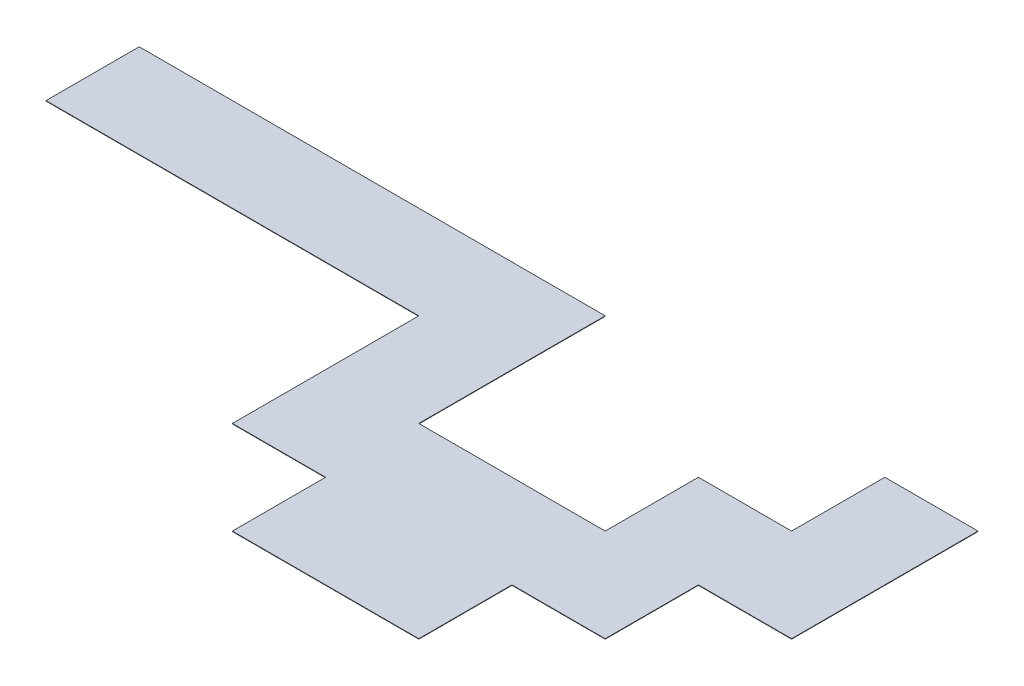
ISO-10303-21;
HEADER;
FILE_DESCRIPTION(('STEP AP214'),'2;1');
FILE_NAME('part.step','',(''),(''),'','','');
FILE_SCHEMA(('AUTOMOTIVE_DESIGN { 1 0 10303 214 1 1 1 1 }'));
ENDSEC;
DATA;
#1=APPLICATION_CONTEXT('core data for automotive mechanical design processes');
#2=APPLICATION_PROTOCOL_DEFINITION('international standard','automotive_design',2000,#1);
#3=PRODUCT_CONTEXT('',#1,'mechanical');
#4=PRODUCT('Part','Part','',(#3));
#5=PRODUCT_RELATED_PRODUCT_CATEGORY('part','',(#4));
#6=PRODUCT_DEFINITION_FORMATION('','',#4);
#7=PRODUCT_DEFINITION_CONTEXT('part definition',#1,'design');
#8=PRODUCT_DEFINITION('design','',#6,#7);
#9=PRODUCT_DEFINITION_SHAPE('','',#8);
#10=(LENGTH_UNIT() NAMED_UNIT(*) SI_UNIT(.MILLI.,.METRE.));
#11=(NAMED_UNIT(*) PLANE_ANGLE_UNIT() SI_UNIT($,.RADIAN.));
#12=(NAMED_UNIT(*) SI_UNIT($,.STERADIAN.) SOLID_ANGLE_UNIT());
#13=UNCERTAINTY_MEASURE_WITH_UNIT(LENGTH_MEASURE(1.E-05),#10,'distance_accuracy_value','');
#14=(GEOMETRIC_REPRESENTATION_CONTEXT(3) GLOBAL_UNCERTAINTY_ASSIGNED_CONTEXT((#13)) GLOBAL_UNIT_ASSIGNED_CONTEXT((#10,
#11,#12)) REPRESENTATION_CONTEXT('',''));
#15=CARTESIAN_POINT('',(0.,0.,0.));
#16=DIRECTION('',(0.,0.,1.));
#17=DIRECTION('',(1.,0.,0.));
#18=AXIS2_PLACEMENT_3D('',#15,#16,#17);
#19=CARTESIAN_POINT('',(4.57318429210723,2.601,2.7766235530204E-13));
#20=DIRECTION('',(1.,0.,0.));
#21=DIRECTION('',(0.,0.,-1.));
#22=AXIS2_PLACEMENT_3D('',#19,#20,#21);
#23=PLANE('',#22);
#24=DIRECTION('',(0.,0.,1.));
#25=VECTOR('',#24,1.);
#26=CARTESIAN_POINT('',(4.57318429210723,2.6,2.7766235530204E-13));
#27=LINE('',#26,#25);
#28=CARTESIAN_POINT('',(4.57318429210704,2.6,2.91907068929162));
#29=VERTEX_POINT('',#28);
#30=CARTESIAN_POINT('',(4.57318429210704,2.6,3.11907068929162));
#31=VERTEX_POINT('',#30);
#32=EDGE_CURVE('E11',#29,#31,#27,.T.);
#33=ORIENTED_EDGE('',*,*,#32,.F.);
#34=DIRECTION('',(0.,-1.,0.));
#35=VECTOR('',#34,1.);
#36=CARTESIAN_POINT('',(4.57318429210704,2.601,2.91907068929162));
#37=LINE('',#36,#35);
#38=CARTESIAN_POINT('',(4.57318429210704,2.601,2.91907068929162));
#39=VERTEX_POINT('',#38);
#40=EDGE_CURVE('E24',#39,#29,#37,.T.);
#41=ORIENTED_EDGE('',*,*,#40,.F.);
#42=DIRECTION('',(0.,0.,1.));
#43=VECTOR('',#42,1.);
#44=CARTESIAN_POINT('',(4.57318429210723,2.601,2.7766235530204E-13));
#45=LINE('',#44,#43);
#46=CARTESIAN_POINT('',(4.57318429210704,2.601,3.11907068929162));
#47=VERTEX_POINT('',#46);
#48=EDGE_CURVE('E291',#39,#47,#45,.T.);
#49=ORIENTED_EDGE('',*,*,#48,.T.);
#50=DIRECTION('',(0.,-1.,0.));
#51=VECTOR('',#50,1.);
#52=CARTESIAN_POINT('',(4.57318429210704,2.601,3.11907068929162));
#53=LINE('',#52,#51);
#54=EDGE_CURVE('E162',#47,#31,#53,.T.);
#55=ORIENTED_EDGE('',*,*,#54,.T.);
#56=EDGE_LOOP('',(#33,#41,#49,#55));
#57=FACE_BOUND('',#56,.T.);
#58=ADVANCED_FACE('F17',(#57),#23,.T.);
#59=CARTESIAN_POINT('',(0.,2.601,2.91907068929162));
#60=DIRECTION('',(0.,0.,-1.));
#61=DIRECTION('',(-1.,0.,0.));
#62=AXIS2_PLACEMENT_3D('',#59,#60,#61);
#63=PLANE('',#62);
#64=DIRECTION('',(1.,0.,0.));
#65=VECTOR('',#64,1.);
#66=CARTESIAN_POINT('',(0.,2.6,2.91907068929162));
#67=LINE('',#66,#65);
#68=CARTESIAN_POINT('',(4.7731842921067,2.6,2.91907068929162));
#69=VERTEX_POINT('',#68);
#70=EDGE_CURVE('E288',#29,#69,#67,.T.);
#71=ORIENTED_EDGE('',*,*,#70,.T.);
#72=DIRECTION('',(0.,-1.,0.));
#73=VECTOR('',#72,1.);
#74=CARTESIAN_POINT('',(4.7731842921067,2.601,2.91907068929162));
#75=LINE('',#74,#73);
#76=CARTESIAN_POINT('',(4.7731842921067,2.601,2.91907068929162));
#77=VERTEX_POINT('',#76);
#78=EDGE_CURVE('E285',#77,#69,#75,.T.);
#79=ORIENTED_EDGE('',*,*,#78,.F.);
#80=DIRECTION('',(1.,0.,0.));
#81=VECTOR('',#80,1.);
#82=CARTESIAN_POINT('',(0.,2.601,2.91907068929162));
#83=LINE('',#82,#81);
#84=EDGE_CURVE('E282',#39,#77,#83,.T.);
#85=ORIENTED_EDGE('',*,*,#84,.F.);
#86=ORIENTED_EDGE('',*,*,#40,.T.);
#87=EDGE_LOOP('',(#71,#79,#85,#86));
#88=FACE_BOUND('',#87,.T.);
#89=ADVANCED_FACE('F294',(#88),#63,.F.);
#90=CARTESIAN_POINT('',(4.77318429210686,2.601,2.69105032517151E-13));
#91=DIRECTION('',(1.,0.,0.));
#92=DIRECTION('',(0.,0.,-1.));
#93=AXIS2_PLACEMENT_3D('',#90,#91,#92);
#94=PLANE('',#93);
#95=DIRECTION('',(0.,0.,1.));
#96=VECTOR('',#95,1.);
#97=CARTESIAN_POINT('',(4.77318429210686,2.6,2.69105032517151E-13));
#98=LINE('',#97,#96);
#99=CARTESIAN_POINT('',(4.7731842921067,2.6,2.71907068929162));
#100=VERTEX_POINT('',#99);
#101=EDGE_CURVE('E279',#100,#69,#98,.T.);
#102=ORIENTED_EDGE('',*,*,#101,.F.);
#103=DIRECTION('',(0.,-1.,0.));
#104=VECTOR('',#103,1.);
#105=CARTESIAN_POINT('',(4.7731842921067,2.601,2.71907068929162));
#106=LINE('',#105,#104);
#107=CARTESIAN_POINT('',(4.7731842921067,2.601,2.71907068929162));
#108=VERTEX_POINT('',#107);
#109=EDGE_CURVE('E276',#108,#100,#106,.T.);
#110=ORIENTED_EDGE('',*,*,#109,.F.);
#111=DIRECTION('',(0.,0.,1.));
#112=VECTOR('',#111,1.);
#113=CARTESIAN_POINT('',(4.77318429210686,2.601,2.69105032517151E-13));
#114=LINE('',#113,#112);
#115=EDGE_CURVE('E273',#108,#77,#114,.T.);
#116=ORIENTED_EDGE('',*,*,#115,.T.);
#117=ORIENTED_EDGE('',*,*,#78,.T.);
#118=EDGE_LOOP('',(#102,#110,#116,#117));
#119=FACE_BOUND('',#118,.T.);
#120=ADVANCED_FACE('F298',(#119),#94,.T.);
#121=CARTESIAN_POINT('',(0.,2.601,2.71907068929162));
#122=DIRECTION('',(0.,0.,-1.));
#123=DIRECTION('',(-1.,0.,0.));
#124=AXIS2_PLACEMENT_3D('',#121,#122,#123);
#125=PLANE('',#124);
#126=DIRECTION('',(1.,0.,0.));
#127=VECTOR('',#126,1.);
#128=CARTESIAN_POINT('',(0.,2.6,2.71907068929162));
#129=LINE('',#128,#127);
#130=CARTESIAN_POINT('',(4.97318429210635,2.6,2.71907068929162));
#131=VERTEX_POINT('',#130);
#132=EDGE_CURVE('E271',#100,#131,#129,.T.);
#133=ORIENTED_EDGE('',*,*,#132,.T.);
#134=DIRECTION('',(0.,-1.,0.));
#135=VECTOR('',#134,1.);
#136=CARTESIAN_POINT('',(4.97318429210635,2.601,2.71907068929162));
#137=LINE('',#136,#135);
#138=CARTESIAN_POINT('',(4.97318429210635,2.601,2.71907068929162));
#139=VERTEX_POINT('',#138);
#140=EDGE_CURVE('E268',#139,#131,#137,.T.);
#141=ORIENTED_EDGE('',*,*,#140,.F.);
#142=DIRECTION('',(1.,0.,0.));
#143=VECTOR('',#142,1.);
#144=CARTESIAN_POINT('',(0.,2.601,2.71907068929162));
#145=LINE('',#144,#143);
#146=EDGE_CURVE('E265',#108,#139,#145,.T.);
#147=ORIENTED_EDGE('',*,*,#146,.F.);
#148=ORIENTED_EDGE('',*,*,#109,.T.);
#149=EDGE_LOOP('',(#133,#141,#147,#148));
#150=FACE_BOUND('',#149,.T.);
#151=ADVANCED_FACE('F302',(#150),#125,.F.);
#152=CARTESIAN_POINT('',(4.97318429210652,2.601,3.01948483965672E-13));
#153=DIRECTION('',(1.,0.,0.));
#154=DIRECTION('',(0.,0.,-1.));
#155=AXIS2_PLACEMENT_3D('',#152,#153,#154);
#156=PLANE('',#155);
#157=DIRECTION('',(0.,0.,1.));
#158=VECTOR('',#157,1.);
#159=CARTESIAN_POINT('',(4.97318429210652,2.6,3.01948483965672E-13));
#160=LINE('',#159,#158);
#161=CARTESIAN_POINT('',(4.97318429210637,2.6,2.31907068929163));
#162=VERTEX_POINT('',#161);
#163=EDGE_CURVE('E262',#162,#131,#160,.T.);
#164=ORIENTED_EDGE('',*,*,#163,.F.);
#165=DIRECTION('',(0.,-1.,0.));
#166=VECTOR('',#165,1.);
#167=CARTESIAN_POINT('',(4.97318429210637,2.601,2.31907068929163));
#168=LINE('',#167,#166);
#169=CARTESIAN_POINT('',(4.97318429210637,2.601,2.31907068929163));
#170=VERTEX_POINT('',#169);
#171=EDGE_CURVE('E259',#170,#162,#168,.T.);
#172=ORIENTED_EDGE('',*,*,#171,.F.);
#173=DIRECTION('',(0.,0.,1.));
#174=VECTOR('',#173,1.);
#175=CARTESIAN_POINT('',(4.97318429210652,2.601,3.01948483965672E-13));
#176=LINE('',#175,#174);
#177=EDGE_CURVE('E256',#170,#139,#176,.T.);
#178=ORIENTED_EDGE('',*,*,#177,.T.);
#179=ORIENTED_EDGE('',*,*,#140,.T.);
#180=EDGE_LOOP('',(#164,#172,#178,#179));
#181=FACE_BOUND('',#180,.T.);
#182=ADVANCED_FACE('F306',(#181),#156,.T.);
#183=CARTESIAN_POINT('',(0.,2.601,2.31907068929161));
#184=DIRECTION('',(0.,0.,-1.));
#185=DIRECTION('',(-1.,0.,0.));
#186=AXIS2_PLACEMENT_3D('',#183,#184,#185);
#187=PLANE('',#186);
#188=DIRECTION('',(1.,0.,0.));
#189=VECTOR('',#188,1.);
#190=CARTESIAN_POINT('',(0.,2.6,2.31907068929161));
#191=LINE('',#190,#189);
#192=CARTESIAN_POINT('',(4.77318429210671,2.6,2.31907068929163));
#193=VERTEX_POINT('',#192);
#194=EDGE_CURVE('E253',#193,#162,#191,.T.);
#195=ORIENTED_EDGE('',*,*,#194,.F.);
#196=DIRECTION('',(0.,-1.,0.));
#197=VECTOR('',#196,1.);
#198=CARTESIAN_POINT('',(4.77318429210671,2.601,2.31907068929163));
#199=LINE('',#198,#197);
#200=CARTESIAN_POINT('',(4.77318429210671,2.601,2.31907068929163));
#201=VERTEX_POINT('',#200);
#202=EDGE_CURVE('E250',#201,#193,#199,.T.);
#203=ORIENTED_EDGE('',*,*,#202,.F.);
#204=DIRECTION('',(1.,0.,0.));
#205=VECTOR('',#204,1.);
#206=CARTESIAN_POINT('',(0.,2.601,2.31907068929161));
#207=LINE('',#206,#205);
#208=EDGE_CURVE('E247',#201,#170,#207,.T.);
#209=ORIENTED_EDGE('',*,*,#208,.T.);
#210=ORIENTED_EDGE('',*,*,#171,.T.);
#211=EDGE_LOOP('',(#195,#203,#209,#210));
#212=FACE_BOUND('',#211,.T.);
#213=ADVANCED_FACE('F308',(#212),#187,.T.);
#214=CARTESIAN_POINT('',(4.77318429210684,2.601,2.6910503251715E-13));
#215=DIRECTION('',(1.,0.,0.));
#216=DIRECTION('',(0.,0.,-1.));
#217=AXIS2_PLACEMENT_3D('',#214,#215,#216);
#218=PLANE('',#217);
#219=DIRECTION('',(0.,0.,1.));
#220=VECTOR('',#219,1.);
#221=CARTESIAN_POINT('',(4.77318429210684,2.6,2.6910503251715E-13));
#222=LINE('',#221,#220);
#223=CARTESIAN_POINT('',(4.7731842921067,2.6,2.51907068929163));
#224=VERTEX_POINT('',#223);
#225=EDGE_CURVE('E245',#193,#224,#222,.T.);
#226=ORIENTED_EDGE('',*,*,#225,.T.);
#227=DIRECTION('',(0.,-1.,0.));
#228=VECTOR('',#227,1.);
#229=CARTESIAN_POINT('',(4.7731842921067,2.601,2.51907068929163));
#230=LINE('',#229,#228);
#231=CARTESIAN_POINT('',(4.7731842921067,2.601,2.51907068929163));
#232=VERTEX_POINT('',#231);
#233=EDGE_CURVE('E242',#232,#224,#230,.T.);
#234=ORIENTED_EDGE('',*,*,#233,.F.);
#235=DIRECTION('',(0.,0.,1.));
#236=VECTOR('',#235,1.);
#237=CARTESIAN_POINT('',(4.77318429210684,2.601,2.6910503251715E-13));
#238=LINE('',#237,#236);
#239=EDGE_CURVE('E239',#201,#232,#238,.T.);
#240=ORIENTED_EDGE('',*,*,#239,.F.);
#241=ORIENTED_EDGE('',*,*,#202,.T.);
#242=EDGE_LOOP('',(#226,#234,#240,#241));
#243=FACE_BOUND('',#242,.T.);
#244=ADVANCED_FACE('F312',(#243),#218,.F.);
#245=CARTESIAN_POINT('',(0.,2.601,2.51907068929163));
#246=DIRECTION('',(0.,0.,-1.));
#247=DIRECTION('',(-1.,0.,0.));
#248=AXIS2_PLACEMENT_3D('',#245,#246,#247);
#249=PLANE('',#248);
#250=DIRECTION('',(1.,0.,0.));
#251=VECTOR('',#250,1.);
#252=CARTESIAN_POINT('',(0.,2.6,2.51907068929163));
#253=LINE('',#252,#251);
#254=CARTESIAN_POINT('',(4.57318429210704,2.6,2.51907068929163));
#255=VERTEX_POINT('',#254);
#256=EDGE_CURVE('E236',#255,#224,#253,.T.);
#257=ORIENTED_EDGE('',*,*,#256,.F.);
#258=DIRECTION('',(0.,-1.,0.));
#259=VECTOR('',#258,1.);
#260=CARTESIAN_POINT('',(4.57318429210704,2.601,2.51907068929163));
#261=LINE('',#260,#259);
#262=CARTESIAN_POINT('',(4.57318429210704,2.601,2.51907068929163));
#263=VERTEX_POINT('',#262);
#264=EDGE_CURVE('E233',#263,#255,#261,.T.);
#265=ORIENTED_EDGE('',*,*,#264,.F.);
#266=DIRECTION('',(1.,0.,0.));
#267=VECTOR('',#266,1.);
#268=CARTESIAN_POINT('',(0.,2.601,2.51907068929163));
#269=LINE('',#268,#267);
#270=EDGE_CURVE('E230',#263,#232,#269,.T.);
#271=ORIENTED_EDGE('',*,*,#270,.T.);
#272=ORIENTED_EDGE('',*,*,#233,.T.);
#273=EDGE_LOOP('',(#257,#265,#271,#272));
#274=FACE_BOUND('',#273,.T.);
#275=ADVANCED_FACE('F315',(#274),#249,.T.);
#276=CARTESIAN_POINT('',(4.5731842921072,2.601,2.77662355302038E-13));
#277=DIRECTION('',(1.,0.,0.));
#278=DIRECTION('',(0.,0.,-1.));
#279=AXIS2_PLACEMENT_3D('',#276,#277,#278);
#280=PLANE('',#279);
#281=DIRECTION('',(0.,0.,1.));
#282=VECTOR('',#281,1.);
#283=CARTESIAN_POINT('',(4.5731842921072,2.6,2.77662355302038E-13));
#284=LINE('',#283,#282);
#285=CARTESIAN_POINT('',(4.57318429210704,2.6,2.71907068929162));
#286=VERTEX_POINT('',#285);
#287=EDGE_CURVE('E228',#255,#286,#284,.T.);
#288=ORIENTED_EDGE('',*,*,#287,.T.);
#289=DIRECTION('',(0.,-1.,0.));
#290=VECTOR('',#289,1.);
#291=CARTESIAN_POINT('',(4.57318429210704,2.601,2.71907068929162));
#292=LINE('',#291,#290);
#293=CARTESIAN_POINT('',(4.57318429210704,2.601,2.71907068929162));
#294=VERTEX_POINT('',#293);
#295=EDGE_CURVE('E225',#294,#286,#292,.T.);
#296=ORIENTED_EDGE('',*,*,#295,.F.);
#297=DIRECTION('',(0.,0.,1.));
#298=VECTOR('',#297,1.);
#299=CARTESIAN_POINT('',(4.5731842921072,2.601,2.77662355302038E-13));
#300=LINE('',#299,#298);
#301=EDGE_CURVE('E222',#263,#294,#300,.T.);
#302=ORIENTED_EDGE('',*,*,#301,.F.);
#303=ORIENTED_EDGE('',*,*,#264,.T.);
#304=EDGE_LOOP('',(#288,#296,#302,#303));
#305=FACE_BOUND('',#304,.T.);
#306=ADVANCED_FACE('F320',(#305),#280,.F.);
#307=CARTESIAN_POINT('',(0.,2.601,2.71907068929162));
#308=DIRECTION('',(0.,0.,-1.));
#309=DIRECTION('',(-1.,0.,0.));
#310=AXIS2_PLACEMENT_3D('',#307,#308,#309);
#311=PLANE('',#310);
#312=DIRECTION('',(1.,0.,0.));
#313=VECTOR('',#312,1.);
#314=CARTESIAN_POINT('',(0.,2.6,2.71907068929162));
#315=LINE('',#314,#313);
#316=CARTESIAN_POINT('',(4.17318429210772,2.6,2.71907068929162));
#317=VERTEX_POINT('',#316);
#318=EDGE_CURVE('E219',#317,#286,#315,.T.);
#319=ORIENTED_EDGE('',*,*,#318,.F.);
#320=DIRECTION('',(0.,-1.,0.));
#321=VECTOR('',#320,1.);
#322=CARTESIAN_POINT('',(4.17318429210772,2.601,2.71907068929162));
#323=LINE('',#322,#321);
#324=CARTESIAN_POINT('',(4.17318429210772,2.601,2.71907068929162));
#325=VERTEX_POINT('',#324);
#326=EDGE_CURVE('E216',#325,#317,#323,.T.);
#327=ORIENTED_EDGE('',*,*,#326,.F.);
#328=DIRECTION('',(1.,0.,0.));
#329=VECTOR('',#328,1.);
#330=CARTESIAN_POINT('',(0.,2.601,2.71907068929162));
#331=LINE('',#330,#329);
#332=EDGE_CURVE('E213',#325,#294,#331,.T.);
#333=ORIENTED_EDGE('',*,*,#332,.T.);
#334=ORIENTED_EDGE('',*,*,#295,.T.);
#335=EDGE_LOOP('',(#319,#327,#333,#334));
#336=FACE_BOUND('',#335,.T.);
#337=ADVANCED_FACE('F322',(#336),#311,.T.);
#338=CARTESIAN_POINT('',(4.17318429210787,2.601,2.3527792473566E-13));
#339=DIRECTION('',(1.,0.,0.));
#340=DIRECTION('',(0.,0.,-1.));
#341=AXIS2_PLACEMENT_3D('',#338,#339,#340);
#342=PLANE('',#341);
#343=DIRECTION('',(0.,0.,1.));
#344=VECTOR('',#343,1.);
#345=CARTESIAN_POINT('',(4.17318429210787,2.6,2.3527792473566E-13));
#346=LINE('',#345,#344);
#347=CARTESIAN_POINT('',(4.17318429210773,2.6,2.31907068929163));
#348=VERTEX_POINT('',#347);
#349=EDGE_CURVE('E210',#348,#317,#346,.T.);
#350=ORIENTED_EDGE('',*,*,#349,.F.);
#351=DIRECTION('',(0.,-1.,0.));
#352=VECTOR('',#351,1.);
#353=CARTESIAN_POINT('',(4.17318429210773,2.601,2.31907068929163));
#354=LINE('',#353,#352);
#355=CARTESIAN_POINT('',(4.17318429210773,2.601,2.31907068929163));
#356=VERTEX_POINT('',#355);
#357=EDGE_CURVE('E207',#356,#348,#354,.T.);
#358=ORIENTED_EDGE('',*,*,#357,.F.);
#359=DIRECTION('',(0.,0.,1.));
#360=VECTOR('',#359,1.);
#361=CARTESIAN_POINT('',(4.17318429210787,2.601,2.3527792473566E-13));
#362=LINE('',#361,#360);
#363=EDGE_CURVE('E204',#356,#325,#362,.T.);
#364=ORIENTED_EDGE('',*,*,#363,.T.);
#365=ORIENTED_EDGE('',*,*,#326,.T.);
#366=EDGE_LOOP('',(#350,#358,#364,#365));
#367=FACE_BOUND('',#366,.T.);
#368=ADVANCED_FACE('F325',(#367),#342,.T.);
#369=CARTESIAN_POINT('',(0.,2.601,2.31907068929163));
#370=DIRECTION('',(0.,0.,-1.));
#371=DIRECTION('',(-1.,0.,0.));
#372=AXIS2_PLACEMENT_3D('',#369,#370,#371);
#373=PLANE('',#372);
#374=DIRECTION('',(1.,0.,0.));
#375=VECTOR('',#374,1.);
#376=CARTESIAN_POINT('',(0.,2.6,2.31907068929163));
#377=LINE('',#376,#375);
#378=CARTESIAN_POINT('',(3.17318429210943,2.6,2.31907068929163));
#379=VERTEX_POINT('',#378);
#380=EDGE_CURVE('E201',#379,#348,#377,.T.);
#381=ORIENTED_EDGE('',*,*,#380,.F.);
#382=DIRECTION('',(0.,-1.,0.));
#383=VECTOR('',#382,1.);
#384=CARTESIAN_POINT('',(3.17318429210943,2.601,2.31907068929163));
#385=LINE('',#384,#383);
#386=CARTESIAN_POINT('',(3.17318429210943,2.601,2.31907068929163));
#387=VERTEX_POINT('',#386);
#388=EDGE_CURVE('E198',#387,#379,#385,.T.);
#389=ORIENTED_EDGE('',*,*,#388,.F.);
#390=DIRECTION('',(1.,0.,0.));
#391=VECTOR('',#390,1.);
#392=CARTESIAN_POINT('',(0.,2.601,2.31907068929163));
#393=LINE('',#392,#391);
#394=EDGE_CURVE('E195',#387,#356,#393,.T.);
#395=ORIENTED_EDGE('',*,*,#394,.T.);
#396=ORIENTED_EDGE('',*,*,#357,.T.);
#397=EDGE_LOOP('',(#381,#389,#395,#396));
#398=FACE_BOUND('',#397,.T.);
#399=ADVANCED_FACE('F328',(#398),#373,.T.);
#400=CARTESIAN_POINT('',(3.17318429210958,2.601,1.85780158372914E-13));
#401=DIRECTION('',(1.,0.,0.));
#402=DIRECTION('',(0.,0.,-1.));
#403=AXIS2_PLACEMENT_3D('',#400,#401,#402);
#404=PLANE('',#403);
#405=DIRECTION('',(0.,0.,1.));
#406=VECTOR('',#405,1.);
#407=CARTESIAN_POINT('',(3.17318429210958,2.6,1.85780158372914E-13));
#408=LINE('',#407,#406);
#409=CARTESIAN_POINT('',(3.17318429210943,2.6,2.51907068929163));
#410=VERTEX_POINT('',#409);
#411=EDGE_CURVE('E193',#379,#410,#408,.T.);
#412=ORIENTED_EDGE('',*,*,#411,.T.);
#413=DIRECTION('',(0.,-1.,0.));
#414=VECTOR('',#413,1.);
#415=CARTESIAN_POINT('',(3.17318429210943,2.601,2.51907068929163));
#416=LINE('',#415,#414);
#417=CARTESIAN_POINT('',(3.17318429210943,2.601,2.51907068929163));
#418=VERTEX_POINT('',#417);
#419=EDGE_CURVE('E190',#418,#410,#416,.T.);
#420=ORIENTED_EDGE('',*,*,#419,.F.);
#421=DIRECTION('',(0.,0.,1.));
#422=VECTOR('',#421,1.);
#423=CARTESIAN_POINT('',(3.17318429210958,2.601,1.85780158372914E-13));
#424=LINE('',#423,#422);
#425=EDGE_CURVE('E187',#387,#418,#424,.T.);
#426=ORIENTED_EDGE('',*,*,#425,.F.);
#427=ORIENTED_EDGE('',*,*,#388,.T.);
#428=EDGE_LOOP('',(#412,#420,#426,#427));
#429=FACE_BOUND('',#428,.T.);
#430=ADVANCED_FACE('F333',(#429),#404,.F.);
#431=CARTESIAN_POINT('',(0.,2.601,2.51907068929163));
#432=DIRECTION('',(0.,0.,-1.));
#433=DIRECTION('',(-1.,0.,0.));
#434=AXIS2_PLACEMENT_3D('',#431,#432,#433);
#435=PLANE('',#434);
#436=DIRECTION('',(1.,0.,0.));
#437=VECTOR('',#436,1.);
#438=CARTESIAN_POINT('',(0.,2.6,2.51907068929163));
#439=LINE('',#438,#437);
#440=CARTESIAN_POINT('',(3.97318429210806,2.6,2.51907068929163));
#441=VERTEX_POINT('',#440);
#442=EDGE_CURVE('E185',#410,#441,#439,.T.);
#443=ORIENTED_EDGE('',*,*,#442,.T.);
#444=DIRECTION('',(0.,-1.,0.));
#445=VECTOR('',#444,1.);
#446=CARTESIAN_POINT('',(3.97318429210806,2.601,2.51907068929163));
#447=LINE('',#446,#445);
#448=CARTESIAN_POINT('',(3.97318429210806,2.601,2.51907068929163));
#449=VERTEX_POINT('',#448);
#450=EDGE_CURVE('E182',#449,#441,#447,.T.);
#451=ORIENTED_EDGE('',*,*,#450,.F.);
#452=DIRECTION('',(1.,0.,0.));
#453=VECTOR('',#452,1.);
#454=CARTESIAN_POINT('',(0.,2.601,2.51907068929163));
#455=LINE('',#454,#453);
#456=EDGE_CURVE('E179',#418,#449,#455,.T.);
#457=ORIENTED_EDGE('',*,*,#456,.F.);
#458=ORIENTED_EDGE('',*,*,#419,.T.);
#459=EDGE_LOOP('',(#443,#451,#457,#458));
#460=FACE_BOUND('',#459,.T.);
#461=ADVANCED_FACE('F336',(#460),#435,.F.);
#462=CARTESIAN_POINT('',(3.97318429210807,2.601,0.));
#463=DIRECTION('',(1.,0.,0.));
#464=DIRECTION('',(0.,0.,-1.));
#465=AXIS2_PLACEMENT_3D('',#462,#463,#464);
#466=PLANE('',#465);
#467=DIRECTION('',(0.,0.,1.));
#468=VECTOR('',#467,1.);
#469=CARTESIAN_POINT('',(3.97318429210807,2.6,0.));
#470=LINE('',#469,#468);
#471=CARTESIAN_POINT('',(3.97318429210806,2.6,2.91907068929162));
#472=VERTEX_POINT('',#471);
#473=EDGE_CURVE('E177',#441,#472,#470,.T.);
#474=ORIENTED_EDGE('',*,*,#473,.T.);
#475=DIRECTION('',(0.,-1.,0.));
#476=VECTOR('',#475,1.);
#477=CARTESIAN_POINT('',(3.97318429210806,2.601,2.91907068929162));
#478=LINE('',#477,#476);
#479=CARTESIAN_POINT('',(3.97318429210806,2.601,2.91907068929162));
#480=VERTEX_POINT('',#479);
#481=EDGE_CURVE('E174',#480,#472,#478,.T.);
#482=ORIENTED_EDGE('',*,*,#481,.F.);
#483=DIRECTION('',(0.,0.,1.));
#484=VECTOR('',#483,1.);
#485=CARTESIAN_POINT('',(3.97318429210807,2.601,0.));
#486=LINE('',#485,#484);
#487=EDGE_CURVE('E172',#449,#480,#486,.T.);
#488=ORIENTED_EDGE('',*,*,#487,.F.);
#489=ORIENTED_EDGE('',*,*,#450,.T.);
#490=EDGE_LOOP('',(#474,#482,#488,#489));
#491=FACE_BOUND('',#490,.T.);
#492=ADVANCED_FACE('F340',(#491),#466,.F.);
#493=CARTESIAN_POINT('',(0.,2.601,2.91907068929162));
#494=DIRECTION('',(0.,0.,-1.));
#495=DIRECTION('',(-1.,0.,0.));
#496=AXIS2_PLACEMENT_3D('',#493,#494,#495);
#497=PLANE('',#496);
#498=DIRECTION('',(1.,0.,0.));
#499=VECTOR('',#498,1.);
#500=CARTESIAN_POINT('',(0.,2.6,2.91907068929162));
#501=LINE('',#500,#499);
#502=CARTESIAN_POINT('',(4.17318429210772,2.6,2.91907068929162));
#503=VERTEX_POINT('',#502);
#504=EDGE_CURVE('E170',#472,#503,#501,.T.);
#505=ORIENTED_EDGE('',*,*,#504,.T.);
#506=DIRECTION('',(0.,-1.,0.));
#507=VECTOR('',#506,1.);
#508=CARTESIAN_POINT('',(4.17318429210772,2.601,2.91907068929162));
#509=LINE('',#508,#507);
#510=CARTESIAN_POINT('',(4.17318429210772,2.601,2.91907068929162));
#511=VERTEX_POINT('',#510);
#512=EDGE_CURVE('E168',#511,#503,#509,.T.);
#513=ORIENTED_EDGE('',*,*,#512,.F.);
#514=DIRECTION('',(1.,0.,0.));
#515=VECTOR('',#514,1.);
#516=CARTESIAN_POINT('',(0.,2.601,2.91907068929162));
#517=LINE('',#516,#515);
#518=EDGE_CURVE('E157',#480,#511,#517,.T.);
#519=ORIENTED_EDGE('',*,*,#518,.F.);
#520=ORIENTED_EDGE('',*,*,#481,.T.);
#521=EDGE_LOOP('',(#505,#513,#519,#520));
#522=FACE_BOUND('',#521,.T.);
#523=ADVANCED_FACE('F343',(#522),#497,.F.);
#524=CARTESIAN_POINT('',(4.1731842921079,2.601,2.35277924735662E-13));
#525=DIRECTION('',(1.,0.,0.));
#526=DIRECTION('',(0.,0.,-1.));
#527=AXIS2_PLACEMENT_3D('',#524,#525,#526);
#528=PLANE('',#527);
#529=DIRECTION('',(0.,0.,1.));
#530=VECTOR('',#529,1.);
#531=CARTESIAN_POINT('',(4.1731842921079,2.6,2.35277924735662E-13));
#532=LINE('',#531,#530);
#533=CARTESIAN_POINT('',(4.17318429210772,2.6,3.11907068929162));
#534=VERTEX_POINT('',#533);
#535=EDGE_CURVE('E144',#503,#534,#532,.T.);
#536=ORIENTED_EDGE('',*,*,#535,.T.);
#537=DIRECTION('',(0.,-1.,0.));
#538=VECTOR('',#537,1.);
#539=CARTESIAN_POINT('',(4.17318429210772,2.601,3.11907068929162));
#540=LINE('',#539,#538);
#541=CARTESIAN_POINT('',(4.17318429210772,2.601,3.11907068929162));
#542=VERTEX_POINT('',#541);
#543=EDGE_CURVE('E138',#542,#534,#540,.T.);
#544=ORIENTED_EDGE('',*,*,#543,.F.);
#545=DIRECTION('',(0.,0.,1.));
#546=VECTOR('',#545,1.);
#547=CARTESIAN_POINT('',(4.1731842921079,2.601,2.35277924735662E-13));
#548=LINE('',#547,#546);
#549=EDGE_CURVE('E142',#511,#542,#548,.T.);
#550=ORIENTED_EDGE('',*,*,#549,.F.);
#551=ORIENTED_EDGE('',*,*,#512,.T.);
#552=EDGE_LOOP('',(#536,#544,#550,#551));
#553=FACE_BOUND('',#552,.T.);
#554=ADVANCED_FACE('F140',(#553),#528,.F.);
#555=CARTESIAN_POINT('',(0.,2.601,3.11907068929162));
#556=DIRECTION('',(0.,0.,-1.));
#557=DIRECTION('',(-1.,0.,0.));
#558=AXIS2_PLACEMENT_3D('',#555,#556,#557);
#559=PLANE('',#558);
#560=DIRECTION('',(1.,0.,0.));
#561=VECTOR('',#560,1.);
#562=CARTESIAN_POINT('',(0.,2.6,3.11907068929162));
#563=LINE('',#562,#561);
#564=EDGE_CURVE('E158',#534,#31,#563,.T.);
#565=ORIENTED_EDGE('',*,*,#564,.T.);
#566=ORIENTED_EDGE('',*,*,#54,.F.);
#567=DIRECTION('',(1.,0.,0.));
#568=VECTOR('',#567,1.);
#569=CARTESIAN_POINT('',(0.,2.601,3.11907068929162));
#570=LINE('',#569,#568);
#571=EDGE_CURVE('E154',#542,#47,#570,.T.);
#572=ORIENTED_EDGE('',*,*,#571,.F.);
#573=ORIENTED_EDGE('',*,*,#543,.T.);
#574=EDGE_LOOP('',(#565,#566,#572,#573));
#575=FACE_BOUND('',#574,.T.);
#576=ADVANCED_FACE('F161',(#575),#559,.F.);
#577=CARTESIAN_POINT('',(0.,2.601,0.));
#578=DIRECTION('',(0.,1.,0.));
#579=DIRECTION('',(0.,0.,1.));
#580=AXIS2_PLACEMENT_3D('',#577,#578,#579);
#581=PLANE('',#580);
#582=ORIENTED_EDGE('',*,*,#48,.F.);
#583=ORIENTED_EDGE('',*,*,#84,.T.);
#584=ORIENTED_EDGE('',*,*,#115,.F.);
#585=ORIENTED_EDGE('',*,*,#146,.T.);
#586=ORIENTED_EDGE('',*,*,#177,.F.);
#587=ORIENTED_EDGE('',*,*,#208,.F.);
#588=ORIENTED_EDGE('',*,*,#239,.T.);
#589=ORIENTED_EDGE('',*,*,#270,.F.);
#590=ORIENTED_EDGE('',*,*,#301,.T.);
#591=ORIENTED_EDGE('',*,*,#332,.F.);
#592=ORIENTED_EDGE('',*,*,#363,.F.);
#593=ORIENTED_EDGE('',*,*,#394,.F.);
#594=ORIENTED_EDGE('',*,*,#425,.T.);
#595=ORIENTED_EDGE('',*,*,#456,.T.);
#596=ORIENTED_EDGE('',*,*,#487,.T.);
#597=ORIENTED_EDGE('',*,*,#518,.T.);
#598=ORIENTED_EDGE('',*,*,#549,.T.);
#599=ORIENTED_EDGE('',*,*,#571,.T.);
#600=EDGE_LOOP('',(#582,#583,#584,#585,#586,#587,#588,#589,#590,#591,#592,#593,#594,#595,#596,
#597,#598,#599));
#601=FACE_BOUND('',#600,.T.);
#602=ADVANCED_FACE('F153',(#601),#581,.T.);
#603=CARTESIAN_POINT('',(0.,2.6,0.));
#604=DIRECTION('',(0.,1.,0.));
#605=DIRECTION('',(0.,0.,1.));
#606=AXIS2_PLACEMENT_3D('',#603,#604,#605);
#607=PLANE('',#606);
#608=ORIENTED_EDGE('',*,*,#32,.T.);
#609=ORIENTED_EDGE('',*,*,#564,.F.);
#610=ORIENTED_EDGE('',*,*,#535,.F.);
#611=ORIENTED_EDGE('',*,*,#504,.F.);
#612=ORIENTED_EDGE('',*,*,#473,.F.);
#613=ORIENTED_EDGE('',*,*,#442,.F.);
#614=ORIENTED_EDGE('',*,*,#411,.F.);
#615=ORIENTED_EDGE('',*,*,#380,.T.);
#616=ORIENTED_EDGE('',*,*,#349,.T.);
#617=ORIENTED_EDGE('',*,*,#318,.T.);
#618=ORIENTED_EDGE('',*,*,#287,.F.);
#619=ORIENTED_EDGE('',*,*,#256,.T.);
#620=ORIENTED_EDGE('',*,*,#225,.F.);
#621=ORIENTED_EDGE('',*,*,#194,.T.);
#622=ORIENTED_EDGE('',*,*,#163,.T.);
#623=ORIENTED_EDGE('',*,*,#132,.F.);
#624=ORIENTED_EDGE('',*,*,#101,.T.);
#625=ORIENTED_EDGE('',*,*,#70,.F.);
#626=EDGE_LOOP('',(#608,#609,#610,#611,#612,#613,#614,#615,#616,#617,#618,#619,#620,#621,#622,
#623,#624,#625));
#627=FACE_BOUND('',#626,.T.);
#628=ADVANCED_FACE('F295',(#627),#607,.F.);
#629=CLOSED_SHELL('',(#58,#89,#120,#151,#182,#213,#244,#275,#306,#337,#368,#399,#430,#461,#492,
#523,#554,#576,#602,#628));
#630=MANIFOLD_SOLID_BREP('B1',#629);
#631=ADVANCED_BREP_SHAPE_REPRESENTATION('',(#18,#630),#14);
#632=SHAPE_DEFINITION_REPRESENTATION(#9,#631);
ENDSEC;
END-ISO-10303-21;
